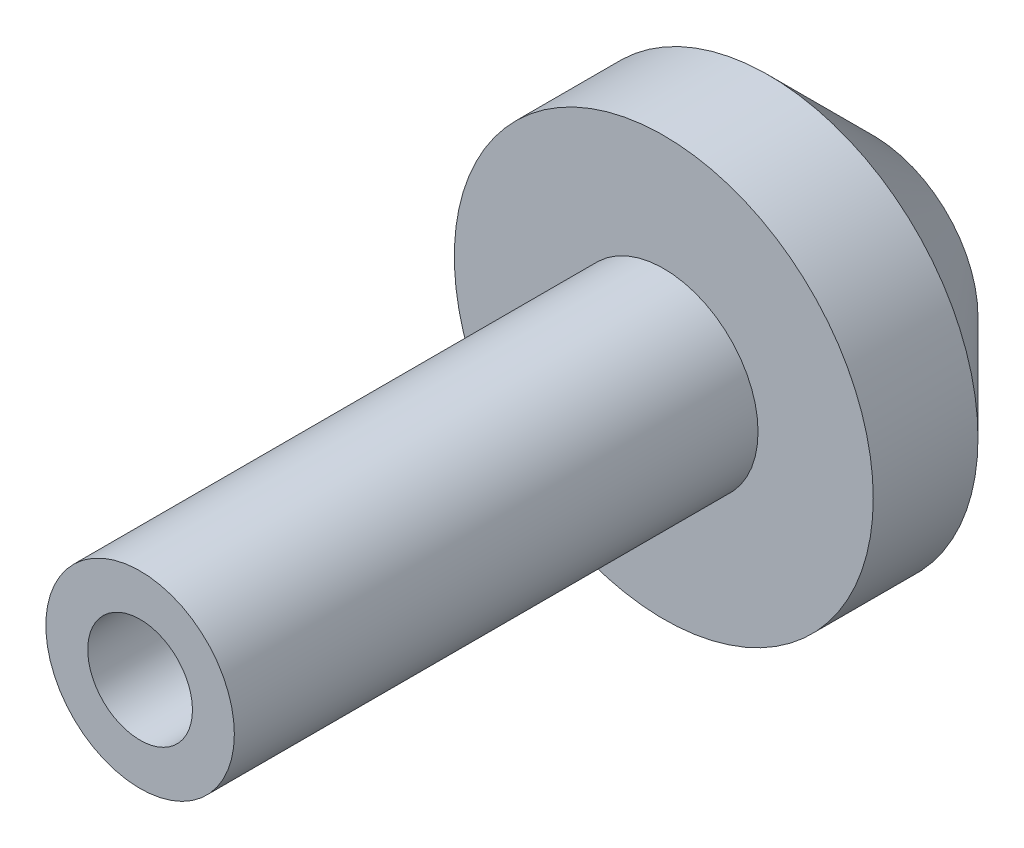
ISO-10303-21;
HEADER;
FILE_DESCRIPTION(('STEP AP214'),'2;1');
FILE_NAME('part.step','',(''),(''),'','','');
FILE_SCHEMA(('AUTOMOTIVE_DESIGN { 1 0 10303 214 1 1 1 1 }'));
ENDSEC;
DATA;
#1=APPLICATION_CONTEXT('core data for automotive mechanical design processes');
#2=APPLICATION_PROTOCOL_DEFINITION('international standard','automotive_design',2000,#1);
#3=PRODUCT_CONTEXT('',#1,'mechanical');
#4=PRODUCT('Part','Part','',(#3));
#5=PRODUCT_RELATED_PRODUCT_CATEGORY('part','',(#4));
#6=PRODUCT_DEFINITION_FORMATION('','',#4);
#7=PRODUCT_DEFINITION_CONTEXT('part definition',#1,'design');
#8=PRODUCT_DEFINITION('design','',#6,#7);
#9=PRODUCT_DEFINITION_SHAPE('','',#8);
#10=(LENGTH_UNIT() NAMED_UNIT(*) SI_UNIT(.MILLI.,.METRE.));
#11=(NAMED_UNIT(*) PLANE_ANGLE_UNIT() SI_UNIT($,.RADIAN.));
#12=(NAMED_UNIT(*) SI_UNIT($,.STERADIAN.) SOLID_ANGLE_UNIT());
#13=UNCERTAINTY_MEASURE_WITH_UNIT(LENGTH_MEASURE(1.E-05),#10,'distance_accuracy_value','');
#14=(GEOMETRIC_REPRESENTATION_CONTEXT(3) GLOBAL_UNCERTAINTY_ASSIGNED_CONTEXT((#13)) GLOBAL_UNIT_ASSIGNED_CONTEXT((#10,
#11,#12)) REPRESENTATION_CONTEXT('',''));
#15=CARTESIAN_POINT('',(0.,0.,0.));
#16=DIRECTION('',(0.,0.,1.));
#17=DIRECTION('',(1.,0.,0.));
#18=AXIS2_PLACEMENT_3D('',#15,#16,#17);
#19=CARTESIAN_POINT('',(0.,0.,5.));
#20=DIRECTION('',(0.,0.,-1.));
#21=DIRECTION('',(-1.,0.,0.));
#22=AXIS2_PLACEMENT_3D('',#19,#20,#21);
#23=CYLINDRICAL_SURFACE('',#22,5.);
#24=CARTESIAN_POINT('',(0.,0.,2.5));
#25=DIRECTION('',(0.,0.,1.));
#26=DIRECTION('',(1.,0.,0.));
#27=AXIS2_PLACEMENT_3D('',#24,#25,#26);
#28=CIRCLE('',#27,5.);
#29=CARTESIAN_POINT('',(5.,0.,2.5));
#30=VERTEX_POINT('',#29);
#31=EDGE_CURVE('E40',#30,#30,#28,.T.);
#32=ORIENTED_EDGE('',*,*,#31,.T.);
#33=EDGE_LOOP('',(#32));
#34=FACE_BOUND('',#33,.T.);
#35=CARTESIAN_POINT('',(0.,0.,5.));
#36=DIRECTION('',(0.,0.,1.));
#37=DIRECTION('',(1.,0.,0.));
#38=AXIS2_PLACEMENT_3D('',#35,#36,#37);
#39=CIRCLE('',#38,5.);
#40=CARTESIAN_POINT('',(5.,0.,5.));
#41=VERTEX_POINT('',#40);
#42=EDGE_CURVE('E48',#41,#41,#39,.T.);
#43=ORIENTED_EDGE('',*,*,#42,.F.);
#44=EDGE_LOOP('',(#43));
#45=FACE_BOUND('',#44,.T.);
#46=ADVANCED_FACE('F32',(#34,#45),#23,.T.);
#47=CARTESIAN_POINT('',(0.,0.,5.));
#48=DIRECTION('',(0.,0.,1.));
#49=DIRECTION('',(1.,0.,0.));
#50=AXIS2_PLACEMENT_3D('',#47,#48,#49);
#51=PLANE('',#50);
#52=CARTESIAN_POINT('',(0.,0.,5.));
#53=DIRECTION('',(0.,0.,1.));
#54=DIRECTION('',(1.,0.,0.));
#55=AXIS2_PLACEMENT_3D('',#52,#53,#54);
#56=CIRCLE('',#55,2.25);
#57=CARTESIAN_POINT('',(2.25,0.,5.));
#58=VERTEX_POINT('',#57);
#59=EDGE_CURVE('E44',#58,#58,#56,.T.);
#60=ORIENTED_EDGE('',*,*,#59,.F.);
#61=EDGE_LOOP('',(#60));
#62=FACE_BOUND('',#61,.T.);
#63=ORIENTED_EDGE('',*,*,#42,.T.);
#64=EDGE_LOOP('',(#63));
#65=FACE_BOUND('',#64,.T.);
#66=ADVANCED_FACE('F84',(#62,#65),#51,.T.);
#67=CARTESIAN_POINT('',(0.,0.,0.));
#68=DIRECTION('',(0.,0.,1.));
#69=DIRECTION('',(1.,0.,0.));
#70=AXIS2_PLACEMENT_3D('',#67,#68,#69);
#71=PLANE('',#70);
#72=CARTESIAN_POINT('',(0.,0.,0.));
#73=DIRECTION('',(0.,0.,1.));
#74=DIRECTION('',(1.,0.,0.));
#75=AXIS2_PLACEMENT_3D('',#72,#73,#74);
#76=CIRCLE('',#75,2.49999999999999);
#77=CARTESIAN_POINT('',(2.49999999999999,0.,0.));
#78=VERTEX_POINT('',#77);
#79=EDGE_CURVE('E10',#78,#78,#76,.F.);
#80=ORIENTED_EDGE('',*,*,#79,.T.);
#81=EDGE_LOOP('',(#80));
#82=FACE_BOUND('',#81,.T.);
#83=ADVANCED_FACE('F80',(#82),#71,.F.);
#84=CARTESIAN_POINT('',(0.,0.,17.5));
#85=DIRECTION('',(0.,0.,-1.));
#86=DIRECTION('',(-1.,0.,0.));
#87=AXIS2_PLACEMENT_3D('',#84,#85,#86);
#88=CYLINDRICAL_SURFACE('',#87,2.25);
#89=CARTESIAN_POINT('',(0.,0.,17.5));
#90=DIRECTION('',(0.,0.,1.));
#91=DIRECTION('',(1.,0.,0.));
#92=AXIS2_PLACEMENT_3D('',#89,#90,#91);
#93=CIRCLE('',#92,2.25);
#94=CARTESIAN_POINT('',(2.25,0.,17.5));
#95=VERTEX_POINT('',#94);
#96=EDGE_CURVE('E52',#95,#95,#93,.T.);
#97=ORIENTED_EDGE('',*,*,#96,.F.);
#98=EDGE_LOOP('',(#97));
#99=FACE_BOUND('',#98,.T.);
#100=ORIENTED_EDGE('',*,*,#59,.T.);
#101=EDGE_LOOP('',(#100));
#102=FACE_BOUND('',#101,.T.);
#103=ADVANCED_FACE('F74',(#99,#102),#88,.T.);
#104=CARTESIAN_POINT('',(0.,0.,17.5));
#105=DIRECTION('',(0.,0.,1.));
#106=DIRECTION('',(1.,0.,0.));
#107=AXIS2_PLACEMENT_3D('',#104,#105,#106);
#108=PLANE('',#107);
#109=CARTESIAN_POINT('',(0.,0.,17.5));
#110=DIRECTION('',(0.,0.,1.));
#111=DIRECTION('',(1.,0.,0.));
#112=AXIS2_PLACEMENT_3D('',#109,#110,#111);
#113=CIRCLE('',#112,1.25);
#114=CARTESIAN_POINT('',(1.25,0.,17.5));
#115=VERTEX_POINT('',#114);
#116=EDGE_CURVE('E57',#115,#115,#113,.T.);
#117=ORIENTED_EDGE('',*,*,#116,.F.);
#118=EDGE_LOOP('',(#117));
#119=FACE_BOUND('',#118,.T.);
#120=ORIENTED_EDGE('',*,*,#96,.T.);
#121=EDGE_LOOP('',(#120));
#122=FACE_BOUND('',#121,.T.);
#123=ADVANCED_FACE('F68',(#119,#122),#108,.T.);
#124=CARTESIAN_POINT('',(0.,0.,7.5));
#125=DIRECTION('',(0.,0.,1.));
#126=DIRECTION('',(1.,0.,0.));
#127=AXIS2_PLACEMENT_3D('',#124,#125,#126);
#128=CYLINDRICAL_SURFACE('',#127,1.25);
#129=CARTESIAN_POINT('',(0.,0.,7.5));
#130=DIRECTION('',(0.,0.,1.));
#131=DIRECTION('',(1.,0.,0.));
#132=AXIS2_PLACEMENT_3D('',#129,#130,#131);
#133=CIRCLE('',#132,1.25);
#134=CARTESIAN_POINT('',(1.25,0.,7.5));
#135=VERTEX_POINT('',#134);
#136=EDGE_CURVE('E56',#135,#135,#133,.T.);
#137=ORIENTED_EDGE('',*,*,#136,.F.);
#138=EDGE_LOOP('',(#137));
#139=FACE_BOUND('',#138,.T.);
#140=ORIENTED_EDGE('',*,*,#116,.T.);
#141=EDGE_LOOP('',(#140));
#142=FACE_BOUND('',#141,.T.);
#143=ADVANCED_FACE('F65',(#139,#142),#128,.F.);
#144=CARTESIAN_POINT('',(0.,0.,7.5));
#145=DIRECTION('',(0.,0.,1.));
#146=DIRECTION('',(1.,0.,0.));
#147=AXIS2_PLACEMENT_3D('',#144,#145,#146);
#148=PLANE('',#147);
#149=ORIENTED_EDGE('',*,*,#136,.T.);
#150=EDGE_LOOP('',(#149));
#151=FACE_BOUND('',#150,.T.);
#152=ADVANCED_FACE('F63',(#151),#148,.T.);
#153=CARTESIAN_POINT('',(0.,0.,2.5));
#154=DIRECTION('',(0.,0.,1.));
#155=DIRECTION('',(1.,0.,0.));
#156=AXIS2_PLACEMENT_3D('',#153,#154,#155);
#157=CONICAL_SURFACE('',#156,5.,0.78539816339745);
#158=CARTESIAN_POINT('',(2.49999999999999,0.,0.));
#159=CARTESIAN_POINT('',(2.52604166666665,0.,0.0260416666666663));
#160=CARTESIAN_POINT('',(2.55208333333332,0.,0.052083333333333));
#161=CARTESIAN_POINT('',(2.60416666666665,0.,0.104166666666666));
#162=CARTESIAN_POINT('',(2.63020833333332,0.,0.130208333333333));
#163=CARTESIAN_POINT('',(2.68229166666666,0.,0.182291666666667));
#164=CARTESIAN_POINT('',(2.70833333333332,0.,0.208333333333333));
#165=CARTESIAN_POINT('',(2.76041666666666,0.,0.260416666666667));
#166=CARTESIAN_POINT('',(2.78645833333332,0.,0.286458333333334));
#167=CARTESIAN_POINT('',(2.83854166666666,0.,0.338541666666667));
#168=CARTESIAN_POINT('',(2.86458333333332,0.,0.364583333333334));
#169=CARTESIAN_POINT('',(2.91666666666666,0.,0.416666666666667));
#170=CARTESIAN_POINT('',(2.94270833333332,0.,0.442708333333334));
#171=CARTESIAN_POINT('',(2.99479166666666,0.,0.494791666666667));
#172=CARTESIAN_POINT('',(3.02083333333332,0.,0.520833333333334));
#173=CARTESIAN_POINT('',(3.07291666666666,0.,0.572916666666668));
#174=CARTESIAN_POINT('',(3.09895833333332,0.,0.598958333333334));
#175=CARTESIAN_POINT('',(3.15104166666666,0.,0.651041666666668));
#176=CARTESIAN_POINT('',(3.17708333333332,0.,0.677083333333334));
#177=CARTESIAN_POINT('',(3.22916666666666,0.,0.729166666666667));
#178=CARTESIAN_POINT('',(3.25520833333332,0.,0.755208333333334));
#179=CARTESIAN_POINT('',(3.30729166666666,0.,0.807291666666668));
#180=CARTESIAN_POINT('',(3.33333333333333,0.,0.833333333333334));
#181=CARTESIAN_POINT('',(3.38541666666666,0.,0.885416666666668));
#182=CARTESIAN_POINT('',(3.41145833333333,0.,0.911458333333335));
#183=CARTESIAN_POINT('',(3.46354166666666,0.,0.963541666666668));
#184=CARTESIAN_POINT('',(3.48958333333333,0.,0.989583333333335));
#185=CARTESIAN_POINT('',(3.54166666666666,0.,1.04166666666667));
#186=CARTESIAN_POINT('',(3.56770833333333,0.,1.06770833333334));
#187=CARTESIAN_POINT('',(3.61979166666666,0.,1.11979166666667));
#188=CARTESIAN_POINT('',(3.64583333333333,0.,1.14583333333334));
#189=CARTESIAN_POINT('',(3.69791666666666,0.,1.19791666666667));
#190=CARTESIAN_POINT('',(3.72395833333333,0.,1.22395833333334));
#191=CARTESIAN_POINT('',(3.77604166666666,0.,1.27604166666667));
#192=CARTESIAN_POINT('',(3.80208333333333,0.,1.30208333333334));
#193=CARTESIAN_POINT('',(3.85416666666666,0.,1.35416666666667));
#194=CARTESIAN_POINT('',(3.88020833333333,0.,1.38020833333334));
#195=CARTESIAN_POINT('',(3.93229166666666,0.,1.43229166666667));
#196=CARTESIAN_POINT('',(3.95833333333333,0.,1.45833333333334));
#197=CARTESIAN_POINT('',(4.01041666666666,0.,1.51041666666667));
#198=CARTESIAN_POINT('',(4.03645833333333,0.,1.53645833333334));
#199=CARTESIAN_POINT('',(4.08854166666666,0.,1.58854166666667));
#200=CARTESIAN_POINT('',(4.11458333333333,0.,1.61458333333334));
#201=CARTESIAN_POINT('',(4.16666666666666,0.,1.66666666666667));
#202=CARTESIAN_POINT('',(4.19270833333333,0.,1.69270833333334));
#203=CARTESIAN_POINT('',(4.24479166666666,0.,1.74479166666667));
#204=CARTESIAN_POINT('',(4.27083333333333,0.,1.77083333333334));
#205=CARTESIAN_POINT('',(4.32291666666666,0.,1.82291666666667));
#206=CARTESIAN_POINT('',(4.34895833333333,0.,1.84895833333334));
#207=CARTESIAN_POINT('',(4.40104166666666,0.,1.90104166666667));
#208=CARTESIAN_POINT('',(4.42708333333333,0.,1.92708333333334));
#209=CARTESIAN_POINT('',(4.47916666666666,0.,1.97916666666667));
#210=CARTESIAN_POINT('',(4.50520833333333,0.,2.00520833333334));
#211=CARTESIAN_POINT('',(4.55729166666666,0.,2.05729166666667));
#212=CARTESIAN_POINT('',(4.58333333333333,0.,2.08333333333334));
#213=CARTESIAN_POINT('',(4.63541666666666,0.,2.13541666666667));
#214=CARTESIAN_POINT('',(4.66145833333333,0.,2.16145833333334));
#215=CARTESIAN_POINT('',(4.71354166666666,0.,2.21354166666667));
#216=CARTESIAN_POINT('',(4.73958333333333,0.,2.23958333333334));
#217=CARTESIAN_POINT('',(4.79166666666667,0.,2.29166666666667));
#218=CARTESIAN_POINT('',(4.81770833333333,0.,2.31770833333334));
#219=CARTESIAN_POINT('',(4.86979166666667,0.,2.36979166666667));
#220=CARTESIAN_POINT('',(4.89583333333333,0.,2.39583333333334));
#221=CARTESIAN_POINT('',(4.94791666666667,0.,2.44791666666667));
#222=CARTESIAN_POINT('',(4.97395833333333,0.,2.47395833333334));
#223=CARTESIAN_POINT('',(5.,0.,2.5));
#224=B_SPLINE_CURVE_WITH_KNOTS('',3,(#158,#159,#160,#161,#162,#163,#164,#165,#166,#167,#168,
#169,#170,#171,#172,#173,#174,#175,#176,#177,#178,#179,#180,#181,#182,#183,#184,#185,#186,#187,
#188,#189,#190,#191,#192,#193,#194,#195,#196,#197,#198,#199,#200,#201,#202,#203,#204,#205,#206,
#207,#208,#209,#210,#211,#212,#213,#214,#215,#216,#217,#218,#219,#220,#221,#222,#223),
.UNSPECIFIED.,.F.,.F.,(4,2,2,2,2,2,2,2,2,2,2,2,2,2,2,2,2,2,2,2,2,2,2,2,2,2,2,2,2,2,2,2,4),(0.,
0.110485434560398,0.220970869120797,0.331456303681195,0.441941738241594,0.552427172801992,
0.66291260736239,0.773398041922789,0.883883476483187,0.994368911043586,1.10485434560398,
1.21533978016438,1.32582521472478,1.43631064928518,1.54679608384558,1.65728151840598,
1.76776695296637,1.87825238752677,1.98873782208717,2.09922325664757,2.20970869120797,
2.32019412576837,2.43067956032877,2.54116499488916,2.65165042944956,2.76213586400996,
2.87262129857036,2.98310673313076,3.09359216769116,3.20407760225155,3.31456303681195,
3.42504847137235,3.53553390593275),.UNSPECIFIED.);
#225=EDGE_CURVE('BSEAM35',#78,#30,#224,.T.);
#226=ORIENTED_EDGE('',*,*,#79,.F.);
#227=ORIENTED_EDGE('',*,*,#31,.F.);
#228=ORIENTED_EDGE('',*,*,#225,.T.);
#229=ORIENTED_EDGE('',*,*,#225,.F.);
#230=EDGE_LOOP('',(#226,#228,#227,#229));
#231=FACE_BOUND('',#230,.T.);
#232=ADVANCED_FACE('F35',(#231),#157,.T.);
#233=CLOSED_SHELL('',(#46,#66,#83,#103,#123,#143,#152,#232));
#234=MANIFOLD_SOLID_BREP('B2',#233);
#235=ADVANCED_BREP_SHAPE_REPRESENTATION('',(#18,#234),#14);
#236=SHAPE_DEFINITION_REPRESENTATION(#9,#235);
ENDSEC;
END-ISO-10303-21;
